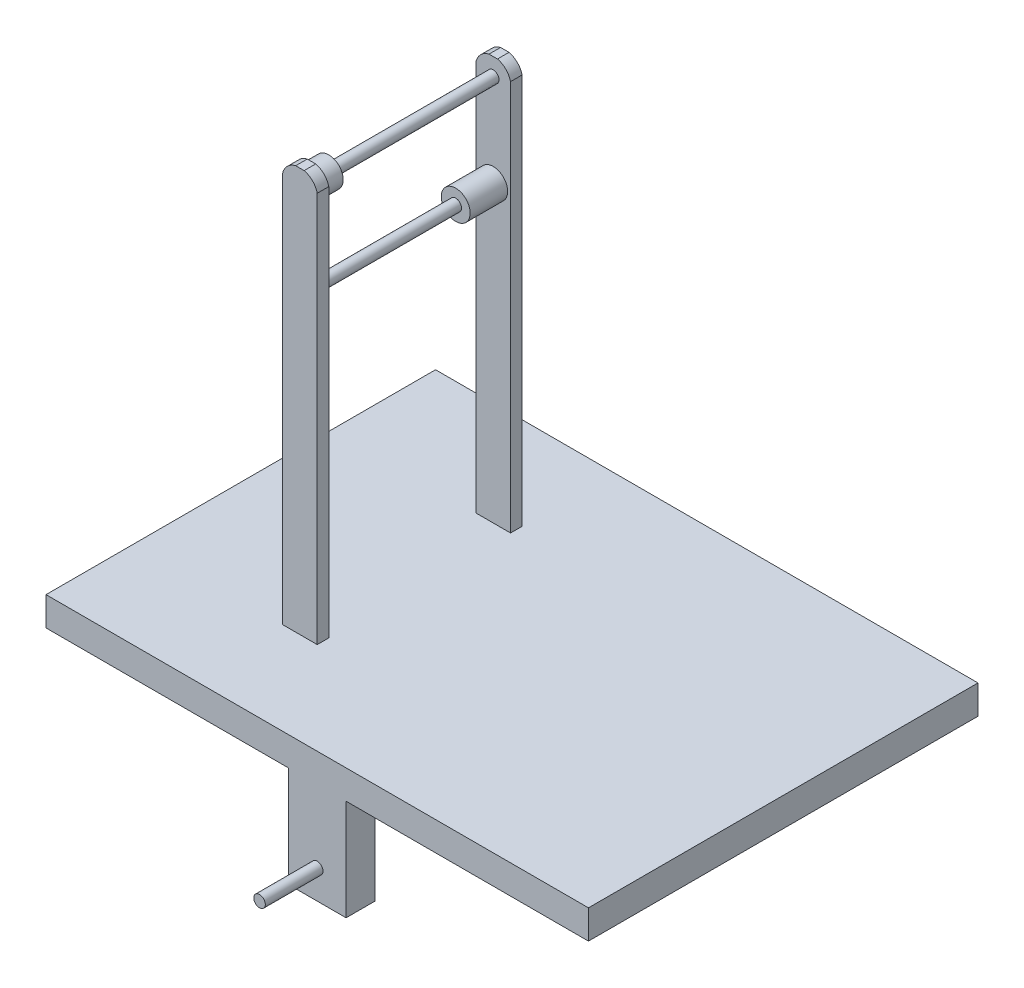
ISO-10303-21;
HEADER;
FILE_DESCRIPTION(('STEP AP214'),'2;1');
FILE_NAME('part.step','',(''),(''),'','','');
FILE_SCHEMA(('AUTOMOTIVE_DESIGN { 1 0 10303 214 1 1 1 1 }'));
ENDSEC;
DATA;
#1=APPLICATION_CONTEXT('core data for automotive mechanical design processes');
#2=APPLICATION_PROTOCOL_DEFINITION('international standard','automotive_design',2000,#1);
#3=PRODUCT_CONTEXT('',#1,'mechanical');
#4=PRODUCT('Part','Part','',(#3));
#5=PRODUCT_RELATED_PRODUCT_CATEGORY('part','',(#4));
#6=PRODUCT_DEFINITION_FORMATION('','',#4);
#7=PRODUCT_DEFINITION_CONTEXT('part definition',#1,'design');
#8=PRODUCT_DEFINITION('design','',#6,#7);
#9=PRODUCT_DEFINITION_SHAPE('','',#8);
#10=(LENGTH_UNIT() NAMED_UNIT(*) SI_UNIT(.MILLI.,.METRE.));
#11=(NAMED_UNIT(*) PLANE_ANGLE_UNIT() SI_UNIT($,.RADIAN.));
#12=(NAMED_UNIT(*) SI_UNIT($,.STERADIAN.) SOLID_ANGLE_UNIT());
#13=UNCERTAINTY_MEASURE_WITH_UNIT(LENGTH_MEASURE(1.E-05),#10,'distance_accuracy_value','');
#14=(GEOMETRIC_REPRESENTATION_CONTEXT(3) GLOBAL_UNCERTAINTY_ASSIGNED_CONTEXT((#13)) GLOBAL_UNIT_ASSIGNED_CONTEXT((#10,
#11,#12)) REPRESENTATION_CONTEXT('',''));
#15=CARTESIAN_POINT('',(0.,0.,0.));
#16=DIRECTION('',(0.,0.,1.));
#17=DIRECTION('',(1.,0.,0.));
#18=AXIS2_PLACEMENT_3D('',#15,#16,#17);
#19=CARTESIAN_POINT('',(0.,0.,0.));
#20=DIRECTION('',(0.,-1.,0.));
#21=DIRECTION('',(0.,0.,-1.));
#22=AXIS2_PLACEMENT_3D('',#19,#20,#21);
#23=PLANE('',#22);
#24=DIRECTION('',(-1.,0.,0.));
#25=VECTOR('',#24,1.);
#26=CARTESIAN_POINT('',(104.,0.,-125.));
#27=LINE('',#26,#25);
#28=CARTESIAN_POINT('',(104.,0.,-125.));
#29=VERTEX_POINT('',#28);
#30=CARTESIAN_POINT('',(84.,0.,-125.));
#31=VERTEX_POINT('',#30);
#32=EDGE_CURVE('E400',#29,#31,#27,.T.);
#33=ORIENTED_EDGE('',*,*,#32,.F.);
#34=DIRECTION('',(0.,0.,1.));
#35=VECTOR('',#34,1.);
#36=CARTESIAN_POINT('',(104.,0.,-135.));
#37=LINE('',#36,#35);
#38=CARTESIAN_POINT('',(104.,0.,-135.));
#39=VERTEX_POINT('',#38);
#40=EDGE_CURVE('E218',#39,#29,#37,.T.);
#41=ORIENTED_EDGE('',*,*,#40,.F.);
#42=DIRECTION('',(-1.,0.,0.));
#43=VECTOR('',#42,1.);
#44=CARTESIAN_POINT('',(0.,0.,-135.));
#45=LINE('',#44,#43);
#46=CARTESIAN_POINT('',(188.,0.,-135.));
#47=VERTEX_POINT('',#46);
#48=EDGE_CURVE('E326',#47,#39,#45,.T.);
#49=ORIENTED_EDGE('',*,*,#48,.F.);
#50=DIRECTION('',(0.,0.,-1.));
#51=VECTOR('',#50,1.);
#52=CARTESIAN_POINT('',(188.,0.,0.));
#53=LINE('',#52,#51);
#54=CARTESIAN_POINT('',(188.,0.,0.));
#55=VERTEX_POINT('',#54);
#56=EDGE_CURVE('E339',#55,#47,#53,.T.);
#57=ORIENTED_EDGE('',*,*,#56,.F.);
#58=DIRECTION('',(1.,0.,0.));
#59=VECTOR('',#58,1.);
#60=CARTESIAN_POINT('',(0.,0.,0.));
#61=LINE('',#60,#59);
#62=CARTESIAN_POINT('',(104.,0.,0.));
#63=VERTEX_POINT('',#62);
#64=EDGE_CURVE('E335',#63,#55,#61,.T.);
#65=ORIENTED_EDGE('',*,*,#64,.F.);
#66=DIRECTION('',(0.,0.,1.));
#67=VECTOR('',#66,1.);
#68=CARTESIAN_POINT('',(104.,0.,0.));
#69=LINE('',#68,#67);
#70=CARTESIAN_POINT('',(104.,0.,-10.));
#71=VERTEX_POINT('',#70);
#72=EDGE_CURVE('E232',#71,#63,#69,.T.);
#73=ORIENTED_EDGE('',*,*,#72,.F.);
#74=DIRECTION('',(1.,0.,0.));
#75=VECTOR('',#74,1.);
#76=CARTESIAN_POINT('',(84.,0.,-10.));
#77=LINE('',#76,#75);
#78=CARTESIAN_POINT('',(84.,0.,-10.));
#79=VERTEX_POINT('',#78);
#80=EDGE_CURVE('E58',#79,#71,#77,.T.);
#81=ORIENTED_EDGE('',*,*,#80,.F.);
#82=DIRECTION('',(0.,0.,-1.));
#83=VECTOR('',#82,1.);
#84=CARTESIAN_POINT('',(84.,0.,0.));
#85=LINE('',#84,#83);
#86=CARTESIAN_POINT('',(84.,0.,0.));
#87=VERTEX_POINT('',#86);
#88=EDGE_CURVE('E223',#87,#79,#85,.T.);
#89=ORIENTED_EDGE('',*,*,#88,.F.);
#90=CARTESIAN_POINT('',(0.,0.,0.));
#91=VERTEX_POINT('',#90);
#92=EDGE_CURVE('E336',#91,#87,#61,.T.);
#93=ORIENTED_EDGE('',*,*,#92,.F.);
#94=DIRECTION('',(0.,0.,1.));
#95=VECTOR('',#94,1.);
#96=CARTESIAN_POINT('',(0.,0.,0.));
#97=LINE('',#96,#95);
#98=CARTESIAN_POINT('',(0.,0.,-135.));
#99=VERTEX_POINT('',#98);
#100=EDGE_CURVE('E322',#99,#91,#97,.T.);
#101=ORIENTED_EDGE('',*,*,#100,.F.);
#102=CARTESIAN_POINT('',(84.,0.,-135.));
#103=VERTEX_POINT('',#102);
#104=EDGE_CURVE('E341',#103,#99,#45,.T.);
#105=ORIENTED_EDGE('',*,*,#104,.F.);
#106=DIRECTION('',(0.,0.,-1.));
#107=VECTOR('',#106,1.);
#108=CARTESIAN_POINT('',(84.,0.,-135.));
#109=LINE('',#108,#107);
#110=EDGE_CURVE('E214',#31,#103,#109,.T.);
#111=ORIENTED_EDGE('',*,*,#110,.F.);
#112=EDGE_LOOP('',(#33,#41,#49,#57,#65,#73,#81,#89,#93,#101,#105,#111));
#113=FACE_BOUND('',#112,.T.);
#114=ADVANCED_FACE('F35',(#113),#23,.T.);
#115=CARTESIAN_POINT('',(50.,150.,-32.));
#116=DIRECTION('',(1.,0.,0.));
#117=DIRECTION('',(0.,0.,-1.));
#118=AXIS2_PLACEMENT_3D('',#115,#116,#117);
#119=PLANE('',#118);
#120=DIRECTION('',(0.,0.,1.));
#121=VECTOR('',#120,1.);
#122=CARTESIAN_POINT('',(50.,145.469087672694,-135.));
#123=LINE('',#122,#121);
#124=CARTESIAN_POINT('',(50.,145.469087672694,-36.));
#125=VERTEX_POINT('',#124);
#126=CARTESIAN_POINT('',(50.,145.469087672694,-32.));
#127=VERTEX_POINT('',#126);
#128=EDGE_CURVE('E258',#125,#127,#123,.T.);
#129=ORIENTED_EDGE('',*,*,#128,.F.);
#130=DIRECTION('',(0.,-1.,0.));
#131=VECTOR('',#130,1.);
#132=CARTESIAN_POINT('',(50.,150.,-36.));
#133=LINE('',#132,#131);
#134=CARTESIAN_POINT('',(50.,10.,-36.));
#135=VERTEX_POINT('',#134);
#136=EDGE_CURVE('E292',#125,#135,#133,.T.);
#137=ORIENTED_EDGE('',*,*,#136,.T.);
#138=DIRECTION('',(0.,0.,1.));
#139=VECTOR('',#138,1.);
#140=CARTESIAN_POINT('',(50.,10.,-32.));
#141=LINE('',#140,#139);
#142=CARTESIAN_POINT('',(50.,10.,-32.));
#143=VERTEX_POINT('',#142);
#144=EDGE_CURVE('E294',#135,#143,#141,.T.);
#145=ORIENTED_EDGE('',*,*,#144,.T.);
#146=DIRECTION('',(0.,-1.,0.));
#147=VECTOR('',#146,1.);
#148=CARTESIAN_POINT('',(50.,150.,-32.));
#149=LINE('',#148,#147);
#150=EDGE_CURVE('E320',#127,#143,#149,.T.);
#151=ORIENTED_EDGE('',*,*,#150,.F.);
#152=EDGE_LOOP('',(#129,#137,#145,#151));
#153=FACE_BOUND('',#152,.T.);
#154=ADVANCED_FACE('F455',(#153),#119,.F.);
#155=CARTESIAN_POINT('',(62.,150.,-32.));
#156=DIRECTION('',(-1.,0.,0.));
#157=DIRECTION('',(0.,0.,1.));
#158=AXIS2_PLACEMENT_3D('',#155,#156,#157);
#159=PLANE('',#158);
#160=DIRECTION('',(0.,0.,1.));
#161=VECTOR('',#160,1.);
#162=CARTESIAN_POINT('',(62.,145.469087672694,-135.));
#163=LINE('',#162,#161);
#164=CARTESIAN_POINT('',(62.,145.469087672694,-36.));
#165=VERTEX_POINT('',#164);
#166=CARTESIAN_POINT('',(62.,145.469087672694,-32.));
#167=VERTEX_POINT('',#166);
#168=EDGE_CURVE('E261',#165,#167,#163,.T.);
#169=ORIENTED_EDGE('',*,*,#168,.T.);
#170=DIRECTION('',(0.,-1.,0.));
#171=VECTOR('',#170,1.);
#172=CARTESIAN_POINT('',(62.,150.,-32.));
#173=LINE('',#172,#171);
#174=CARTESIAN_POINT('',(62.,10.,-32.));
#175=VERTEX_POINT('',#174);
#176=EDGE_CURVE('E318',#167,#175,#173,.T.);
#177=ORIENTED_EDGE('',*,*,#176,.T.);
#178=DIRECTION('',(0.,0.,-1.));
#179=VECTOR('',#178,1.);
#180=CARTESIAN_POINT('',(62.,10.,-32.));
#181=LINE('',#180,#179);
#182=CARTESIAN_POINT('',(62.,10.,-36.));
#183=VERTEX_POINT('',#182);
#184=EDGE_CURVE('E310',#175,#183,#181,.T.);
#185=ORIENTED_EDGE('',*,*,#184,.T.);
#186=DIRECTION('',(0.,-1.,0.));
#187=VECTOR('',#186,1.);
#188=CARTESIAN_POINT('',(62.,150.,-36.));
#189=LINE('',#188,#187);
#190=EDGE_CURVE('E279',#165,#183,#189,.T.);
#191=ORIENTED_EDGE('',*,*,#190,.F.);
#192=EDGE_LOOP('',(#169,#177,#185,#191));
#193=FACE_BOUND('',#192,.T.);
#194=ADVANCED_FACE('F464',(#193),#159,.F.);
#195=CARTESIAN_POINT('',(0.,150.,0.));
#196=DIRECTION('',(0.,-1.,0.));
#197=DIRECTION('',(0.,0.,-1.));
#198=AXIS2_PLACEMENT_3D('',#195,#196,#197);
#199=PLANE('',#198);
#200=DIRECTION('',(0.,0.,1.));
#201=VECTOR('',#200,1.);
#202=CARTESIAN_POINT('',(57.4690876726942,150.,-135.));
#203=LINE('',#202,#201);
#204=CARTESIAN_POINT('',(57.4690876726942,150.,-36.));
#205=VERTEX_POINT('',#204);
#206=CARTESIAN_POINT('',(57.4690876726942,150.,-32.));
#207=VERTEX_POINT('',#206);
#208=EDGE_CURVE('E277',#205,#207,#203,.T.);
#209=ORIENTED_EDGE('',*,*,#208,.F.);
#210=DIRECTION('',(-1.,0.,0.));
#211=VECTOR('',#210,1.);
#212=CARTESIAN_POINT('',(0.,150.,-36.));
#213=LINE('',#212,#211);
#214=CARTESIAN_POINT('',(54.5309123273058,150.,-36.));
#215=VERTEX_POINT('',#214);
#216=EDGE_CURVE('E358',#205,#215,#213,.T.);
#217=ORIENTED_EDGE('',*,*,#216,.T.);
#218=DIRECTION('',(0.,0.,1.));
#219=VECTOR('',#218,1.);
#220=CARTESIAN_POINT('',(54.5309123273058,150.,-135.));
#221=LINE('',#220,#219);
#222=CARTESIAN_POINT('',(54.5309123273058,150.,-32.));
#223=VERTEX_POINT('',#222);
#224=EDGE_CURVE('E274',#223,#215,#221,.F.);
#225=ORIENTED_EDGE('',*,*,#224,.F.);
#226=DIRECTION('',(1.,0.,0.));
#227=VECTOR('',#226,1.);
#228=CARTESIAN_POINT('',(50.,150.,-32.));
#229=LINE('',#228,#227);
#230=EDGE_CURVE('E295',#223,#207,#229,.T.);
#231=ORIENTED_EDGE('',*,*,#230,.T.);
#232=EDGE_LOOP('',(#209,#217,#225,#231));
#233=FACE_BOUND('',#232,.T.);
#234=ADVANCED_FACE('F475',(#233),#199,.F.);
#235=CARTESIAN_POINT('',(50.,145.469087672694,-103.));
#236=VERTEX_POINT('',#235);
#237=CARTESIAN_POINT('',(50.,145.469087672694,-99.));
#238=VERTEX_POINT('',#237);
#239=EDGE_CURVE('E260',#236,#238,#123,.T.);
#240=ORIENTED_EDGE('',*,*,#239,.F.);
#241=DIRECTION('',(0.,-1.,0.));
#242=VECTOR('',#241,1.);
#243=CARTESIAN_POINT('',(50.,150.,-103.));
#244=LINE('',#243,#242);
#245=CARTESIAN_POINT('',(50.,10.,-103.));
#246=VERTEX_POINT('',#245);
#247=EDGE_CURVE('E302',#236,#246,#244,.T.);
#248=ORIENTED_EDGE('',*,*,#247,.T.);
#249=CARTESIAN_POINT('',(50.,10.,-99.));
#250=VERTEX_POINT('',#249);
#251=EDGE_CURVE('E303',#246,#250,#141,.T.);
#252=ORIENTED_EDGE('',*,*,#251,.T.);
#253=DIRECTION('',(0.,1.,0.));
#254=VECTOR('',#253,1.);
#255=CARTESIAN_POINT('',(50.,150.,-99.));
#256=LINE('',#255,#254);
#257=EDGE_CURVE('E287',#250,#238,#256,.T.);
#258=ORIENTED_EDGE('',*,*,#257,.T.);
#259=EDGE_LOOP('',(#240,#248,#252,#258));
#260=FACE_BOUND('',#259,.T.);
#261=ADVANCED_FACE('F497',(#260),#119,.F.);
#262=CARTESIAN_POINT('',(50.,150.,-32.));
#263=DIRECTION('',(0.,0.,-1.));
#264=DIRECTION('',(-1.,0.,0.));
#265=AXIS2_PLACEMENT_3D('',#262,#263,#264);
#266=PLANE('',#265);
#267=CARTESIAN_POINT('',(56.,144.,-32.));
#268=DIRECTION('',(0.,0.,1.));
#269=DIRECTION('',(1.,0.,0.));
#270=AXIS2_PLACEMENT_3D('',#267,#268,#269);
#271=CIRCLE('',#270,6.17723389471876);
#272=EDGE_CURVE('E254',#223,#127,#271,.T.);
#273=ORIENTED_EDGE('',*,*,#272,.T.);
#274=ORIENTED_EDGE('',*,*,#150,.T.);
#275=DIRECTION('',(1.,0.,0.));
#276=VECTOR('',#275,1.);
#277=CARTESIAN_POINT('',(50.,10.,-32.));
#278=LINE('',#277,#276);
#279=EDGE_CURVE('E306',#143,#175,#278,.T.);
#280=ORIENTED_EDGE('',*,*,#279,.T.);
#281=ORIENTED_EDGE('',*,*,#176,.F.);
#282=EDGE_CURVE('E255',#167,#207,#271,.T.);
#283=ORIENTED_EDGE('',*,*,#282,.T.);
#284=ORIENTED_EDGE('',*,*,#230,.F.);
#285=EDGE_LOOP('',(#273,#274,#280,#281,#283,#284));
#286=FACE_BOUND('',#285,.T.);
#287=ADVANCED_FACE('F468',(#286),#266,.F.);
#288=CARTESIAN_POINT('',(62.,145.469087672694,-103.));
#289=VERTEX_POINT('',#288);
#290=CARTESIAN_POINT('',(62.,145.469087672694,-99.));
#291=VERTEX_POINT('',#290);
#292=EDGE_CURVE('E264',#289,#291,#163,.T.);
#293=ORIENTED_EDGE('',*,*,#292,.T.);
#294=DIRECTION('',(0.,1.,0.));
#295=VECTOR('',#294,1.);
#296=CARTESIAN_POINT('',(62.,150.,-99.));
#297=LINE('',#296,#295);
#298=CARTESIAN_POINT('',(62.,10.,-99.));
#299=VERTEX_POINT('',#298);
#300=EDGE_CURVE('E281',#299,#291,#297,.T.);
#301=ORIENTED_EDGE('',*,*,#300,.F.);
#302=CARTESIAN_POINT('',(62.,10.,-103.));
#303=VERTEX_POINT('',#302);
#304=EDGE_CURVE('E309',#299,#303,#181,.T.);
#305=ORIENTED_EDGE('',*,*,#304,.T.);
#306=DIRECTION('',(0.,-1.,0.));
#307=VECTOR('',#306,1.);
#308=CARTESIAN_POINT('',(62.,150.,-103.));
#309=LINE('',#308,#307);
#310=EDGE_CURVE('E316',#289,#303,#309,.T.);
#311=ORIENTED_EDGE('',*,*,#310,.F.);
#312=EDGE_LOOP('',(#293,#301,#305,#311));
#313=FACE_BOUND('',#312,.T.);
#314=ADVANCED_FACE('F634',(#313),#159,.F.);
#315=CARTESIAN_POINT('',(50.,150.,-103.));
#316=DIRECTION('',(0.,0.,1.));
#317=DIRECTION('',(1.,0.,0.));
#318=AXIS2_PLACEMENT_3D('',#315,#316,#317);
#319=PLANE('',#318);
#320=CARTESIAN_POINT('',(56.,144.,-103.));
#321=DIRECTION('',(0.,0.,1.));
#322=DIRECTION('',(1.,0.,0.));
#323=AXIS2_PLACEMENT_3D('',#320,#321,#322);
#324=CIRCLE('',#323,6.17723389471876);
#325=CARTESIAN_POINT('',(57.4690876726942,150.,-103.));
#326=VERTEX_POINT('',#325);
#327=EDGE_CURVE('E270',#289,#326,#324,.T.);
#328=ORIENTED_EDGE('',*,*,#327,.F.);
#329=ORIENTED_EDGE('',*,*,#310,.T.);
#330=DIRECTION('',(-1.,0.,0.));
#331=VECTOR('',#330,1.);
#332=CARTESIAN_POINT('',(50.,10.,-103.));
#333=LINE('',#332,#331);
#334=EDGE_CURVE('E299',#303,#246,#333,.T.);
#335=ORIENTED_EDGE('',*,*,#334,.T.);
#336=ORIENTED_EDGE('',*,*,#247,.F.);
#337=CARTESIAN_POINT('',(54.5309123273058,150.,-103.));
#338=VERTEX_POINT('',#337);
#339=EDGE_CURVE('E267',#338,#236,#324,.T.);
#340=ORIENTED_EDGE('',*,*,#339,.F.);
#341=DIRECTION('',(-1.,0.,0.));
#342=VECTOR('',#341,1.);
#343=CARTESIAN_POINT('',(50.,150.,-103.));
#344=LINE('',#343,#342);
#345=EDGE_CURVE('E298',#326,#338,#344,.T.);
#346=ORIENTED_EDGE('',*,*,#345,.F.);
#347=EDGE_LOOP('',(#328,#329,#335,#336,#340,#346));
#348=FACE_BOUND('',#347,.T.);
#349=ADVANCED_FACE('F782',(#348),#319,.F.);
#350=DIRECTION('',(0.,0.,1.));
#351=VECTOR('',#350,1.);
#352=CARTESIAN_POINT('',(57.4690876726942,150.,-135.));
#353=LINE('',#352,#351);
#354=CARTESIAN_POINT('',(57.4690876726942,150.,-99.));
#355=VERTEX_POINT('',#354);
#356=EDGE_CURVE('E269',#326,#355,#353,.T.);
#357=ORIENTED_EDGE('',*,*,#356,.F.);
#358=ORIENTED_EDGE('',*,*,#345,.T.);
#359=DIRECTION('',(0.,0.,1.));
#360=VECTOR('',#359,1.);
#361=CARTESIAN_POINT('',(54.5309123273058,150.,-135.));
#362=LINE('',#361,#360);
#363=CARTESIAN_POINT('',(54.5309123273058,150.,-99.));
#364=VERTEX_POINT('',#363);
#365=EDGE_CURVE('E265',#364,#338,#362,.F.);
#366=ORIENTED_EDGE('',*,*,#365,.F.);
#367=DIRECTION('',(1.,0.,0.));
#368=VECTOR('',#367,1.);
#369=CARTESIAN_POINT('',(0.,150.,-99.));
#370=LINE('',#369,#368);
#371=EDGE_CURVE('E355',#364,#355,#370,.T.);
#372=ORIENTED_EDGE('',*,*,#371,.T.);
#373=EDGE_LOOP('',(#357,#358,#366,#372));
#374=FACE_BOUND('',#373,.T.);
#375=ADVANCED_FACE('F687',(#374),#199,.F.);
#376=CARTESIAN_POINT('',(-78.,150.,-36.));
#377=DIRECTION('',(0.,0.,1.));
#378=DIRECTION('',(0.,-1.,0.));
#379=AXIS2_PLACEMENT_3D('',#376,#377,#378);
#380=PLANE('',#379);
#381=CARTESIAN_POINT('',(56.,144.,-36.));
#382=DIRECTION('',(0.,0.,1.));
#383=DIRECTION('',(0.,-1.,0.));
#384=AXIS2_PLACEMENT_3D('',#381,#382,#383);
#385=CIRCLE('',#384,5.);
#386=CARTESIAN_POINT('',(56.,139.,-36.));
#387=VERTEX_POINT('',#386);
#388=EDGE_CURVE('E11',#387,#387,#385,.F.);
#389=ORIENTED_EDGE('',*,*,#388,.F.);
#390=EDGE_LOOP('',(#389));
#391=FACE_BOUND('',#390,.T.);
#392=CARTESIAN_POINT('',(56.,112.,-36.));
#393=DIRECTION('',(0.,0.,1.));
#394=DIRECTION('',(0.,-1.,0.));
#395=AXIS2_PLACEMENT_3D('',#392,#393,#394);
#396=CIRCLE('',#395,2.);
#397=CARTESIAN_POINT('',(56.,110.,-36.));
#398=VERTEX_POINT('',#397);
#399=EDGE_CURVE('E373',#398,#398,#396,.F.);
#400=ORIENTED_EDGE('',*,*,#399,.F.);
#401=EDGE_LOOP('',(#400));
#402=FACE_BOUND('',#401,.T.);
#403=CARTESIAN_POINT('',(56.,144.,-36.));
#404=DIRECTION('',(0.,0.,1.));
#405=DIRECTION('',(0.,-1.,0.));
#406=AXIS2_PLACEMENT_3D('',#403,#404,#405);
#407=CIRCLE('',#406,6.17723389471876);
#408=EDGE_CURVE('E275',#165,#205,#407,.T.);
#409=ORIENTED_EDGE('',*,*,#408,.F.);
#410=ORIENTED_EDGE('',*,*,#190,.T.);
#411=DIRECTION('',(1.,0.,0.));
#412=VECTOR('',#411,1.);
#413=CARTESIAN_POINT('',(-78.,10.,-36.));
#414=LINE('',#413,#412);
#415=EDGE_CURVE('E284',#135,#183,#414,.T.);
#416=ORIENTED_EDGE('',*,*,#415,.F.);
#417=ORIENTED_EDGE('',*,*,#136,.F.);
#418=EDGE_CURVE('E272',#215,#125,#407,.T.);
#419=ORIENTED_EDGE('',*,*,#418,.F.);
#420=ORIENTED_EDGE('',*,*,#216,.F.);
#421=EDGE_LOOP('',(#409,#410,#416,#417,#419,#420));
#422=FACE_BOUND('',#421,.T.);
#423=ADVANCED_FACE('F460',(#391,#402,#422),#380,.F.);
#424=CARTESIAN_POINT('',(-78.,150.,-99.));
#425=DIRECTION('',(0.,0.,-1.));
#426=DIRECTION('',(0.,1.,0.));
#427=AXIS2_PLACEMENT_3D('',#424,#425,#426);
#428=PLANE('',#427);
#429=CARTESIAN_POINT('',(56.,112.,-99.));
#430=DIRECTION('',(0.,0.,-1.));
#431=DIRECTION('',(0.,1.,0.));
#432=AXIS2_PLACEMENT_3D('',#429,#430,#431);
#433=CIRCLE('',#432,5.);
#434=CARTESIAN_POINT('',(51.,112.,-99.));
#435=VERTEX_POINT('',#434);
#436=EDGE_CURVE('E43',#435,#435,#433,.F.);
#437=ORIENTED_EDGE('',*,*,#436,.F.);
#438=EDGE_LOOP('',(#437));
#439=FACE_BOUND('',#438,.T.);
#440=CARTESIAN_POINT('',(56.,144.,-99.));
#441=DIRECTION('',(0.,0.,-1.));
#442=DIRECTION('',(0.,1.,0.));
#443=AXIS2_PLACEMENT_3D('',#440,#441,#442);
#444=CIRCLE('',#443,2.);
#445=CARTESIAN_POINT('',(56.,146.,-99.));
#446=VERTEX_POINT('',#445);
#447=EDGE_CURVE('E361',#446,#446,#444,.F.);
#448=ORIENTED_EDGE('',*,*,#447,.F.);
#449=EDGE_LOOP('',(#448));
#450=FACE_BOUND('',#449,.T.);
#451=CARTESIAN_POINT('',(56.,144.,-99.));
#452=DIRECTION('',(0.,0.,-1.));
#453=DIRECTION('',(0.,1.,0.));
#454=AXIS2_PLACEMENT_3D('',#451,#452,#453);
#455=CIRCLE('',#454,6.17723389471876);
#456=EDGE_CURVE('E366',#355,#291,#455,.T.);
#457=ORIENTED_EDGE('',*,*,#456,.F.);
#458=ORIENTED_EDGE('',*,*,#371,.F.);
#459=EDGE_CURVE('E364',#238,#364,#455,.T.);
#460=ORIENTED_EDGE('',*,*,#459,.F.);
#461=ORIENTED_EDGE('',*,*,#257,.F.);
#462=DIRECTION('',(1.,0.,0.));
#463=VECTOR('',#462,1.);
#464=CARTESIAN_POINT('',(-78.,10.,-99.));
#465=LINE('',#464,#463);
#466=EDGE_CURVE('E285',#250,#299,#465,.T.);
#467=ORIENTED_EDGE('',*,*,#466,.T.);
#468=ORIENTED_EDGE('',*,*,#300,.T.);
#469=EDGE_LOOP('',(#457,#458,#460,#461,#467,#468));
#470=FACE_BOUND('',#469,.T.);
#471=ADVANCED_FACE('F441',(#439,#450,#470),#428,.F.);
#472=CARTESIAN_POINT('',(0.,10.,0.));
#473=DIRECTION('',(0.,-1.,0.));
#474=DIRECTION('',(0.,0.,-1.));
#475=AXIS2_PLACEMENT_3D('',#472,#473,#474);
#476=PLANE('',#475);
#477=DIRECTION('',(0.,0.,1.));
#478=VECTOR('',#477,1.);
#479=CARTESIAN_POINT('',(0.,10.,0.));
#480=LINE('',#479,#478);
#481=CARTESIAN_POINT('',(0.,10.,-135.));
#482=VERTEX_POINT('',#481);
#483=CARTESIAN_POINT('',(0.,10.,0.));
#484=VERTEX_POINT('',#483);
#485=EDGE_CURVE('E323',#482,#484,#480,.T.);
#486=ORIENTED_EDGE('',*,*,#485,.T.);
#487=DIRECTION('',(1.,0.,0.));
#488=VECTOR('',#487,1.);
#489=CARTESIAN_POINT('',(0.,10.,0.));
#490=LINE('',#489,#488);
#491=CARTESIAN_POINT('',(188.,10.,0.));
#492=VERTEX_POINT('',#491);
#493=EDGE_CURVE('E325',#484,#492,#490,.T.);
#494=ORIENTED_EDGE('',*,*,#493,.T.);
#495=DIRECTION('',(0.,0.,-1.));
#496=VECTOR('',#495,1.);
#497=CARTESIAN_POINT('',(188.,10.,0.));
#498=LINE('',#497,#496);
#499=CARTESIAN_POINT('',(188.,10.,-135.));
#500=VERTEX_POINT('',#499);
#501=EDGE_CURVE('E328',#492,#500,#498,.T.);
#502=ORIENTED_EDGE('',*,*,#501,.T.);
#503=DIRECTION('',(-1.,0.,0.));
#504=VECTOR('',#503,1.);
#505=CARTESIAN_POINT('',(0.,10.,-135.));
#506=LINE('',#505,#504);
#507=EDGE_CURVE('E330',#500,#482,#506,.T.);
#508=ORIENTED_EDGE('',*,*,#507,.T.);
#509=EDGE_LOOP('',(#486,#494,#502,#508));
#510=FACE_BOUND('',#509,.T.);
#511=ORIENTED_EDGE('',*,*,#466,.F.);
#512=ORIENTED_EDGE('',*,*,#251,.F.);
#513=ORIENTED_EDGE('',*,*,#334,.F.);
#514=ORIENTED_EDGE('',*,*,#304,.F.);
#515=EDGE_LOOP('',(#511,#512,#513,#514));
#516=FACE_BOUND('',#515,.T.);
#517=ORIENTED_EDGE('',*,*,#144,.F.);
#518=ORIENTED_EDGE('',*,*,#415,.T.);
#519=ORIENTED_EDGE('',*,*,#184,.F.);
#520=ORIENTED_EDGE('',*,*,#279,.F.);
#521=EDGE_LOOP('',(#517,#518,#519,#520));
#522=FACE_BOUND('',#521,.T.);
#523=ADVANCED_FACE('F438',(#510,#516,#522),#476,.F.);
#524=CARTESIAN_POINT('',(0.,10.,0.));
#525=DIRECTION('',(1.,0.,0.));
#526=DIRECTION('',(0.,0.,-1.));
#527=AXIS2_PLACEMENT_3D('',#524,#525,#526);
#528=PLANE('',#527);
#529=ORIENTED_EDGE('',*,*,#100,.T.);
#530=DIRECTION('',(0.,-1.,0.));
#531=VECTOR('',#530,1.);
#532=CARTESIAN_POINT('',(0.,10.,0.));
#533=LINE('',#532,#531);
#534=EDGE_CURVE('E352',#484,#91,#533,.T.);
#535=ORIENTED_EDGE('',*,*,#534,.F.);
#536=ORIENTED_EDGE('',*,*,#485,.F.);
#537=DIRECTION('',(0.,-1.,0.));
#538=VECTOR('',#537,1.);
#539=CARTESIAN_POINT('',(0.,10.,-135.));
#540=LINE('',#539,#538);
#541=EDGE_CURVE('E332',#482,#99,#540,.T.);
#542=ORIENTED_EDGE('',*,*,#541,.T.);
#543=EDGE_LOOP('',(#529,#535,#536,#542));
#544=FACE_BOUND('',#543,.T.);
#545=ADVANCED_FACE('F37',(#544),#528,.F.);
#546=CARTESIAN_POINT('',(0.,10.,0.));
#547=DIRECTION('',(0.,0.,-1.));
#548=DIRECTION('',(-1.,0.,0.));
#549=AXIS2_PLACEMENT_3D('',#546,#547,#548);
#550=PLANE('',#549);
#551=CARTESIAN_POINT('',(94.,-25.,0.));
#552=DIRECTION('',(0.,0.,-1.));
#553=DIRECTION('',(-1.,0.,0.));
#554=AXIS2_PLACEMENT_3D('',#551,#552,#553);
#555=CIRCLE('',#554,2.);
#556=CARTESIAN_POINT('',(92.,-25.,0.));
#557=VERTEX_POINT('',#556);
#558=EDGE_CURVE('E367',#557,#557,#555,.F.);
#559=ORIENTED_EDGE('',*,*,#558,.F.);
#560=EDGE_LOOP('',(#559));
#561=FACE_BOUND('',#560,.T.);
#562=ORIENTED_EDGE('',*,*,#92,.T.);
#563=DIRECTION('',(0.,1.,0.));
#564=VECTOR('',#563,1.);
#565=CARTESIAN_POINT('',(84.,-35.,0.));
#566=LINE('',#565,#564);
#567=CARTESIAN_POINT('',(84.,-35.,0.));
#568=VERTEX_POINT('',#567);
#569=EDGE_CURVE('E238',#568,#87,#566,.T.);
#570=ORIENTED_EDGE('',*,*,#569,.F.);
#571=DIRECTION('',(-1.,0.,0.));
#572=VECTOR('',#571,1.);
#573=CARTESIAN_POINT('',(84.,-35.,0.));
#574=LINE('',#573,#572);
#575=CARTESIAN_POINT('',(104.,-35.,0.));
#576=VERTEX_POINT('',#575);
#577=EDGE_CURVE('E236',#576,#568,#574,.T.);
#578=ORIENTED_EDGE('',*,*,#577,.F.);
#579=DIRECTION('',(0.,1.,0.));
#580=VECTOR('',#579,1.);
#581=CARTESIAN_POINT('',(104.,-35.,0.));
#582=LINE('',#581,#580);
#583=EDGE_CURVE('E246',#576,#63,#582,.T.);
#584=ORIENTED_EDGE('',*,*,#583,.T.);
#585=ORIENTED_EDGE('',*,*,#64,.T.);
#586=DIRECTION('',(0.,-1.,0.));
#587=VECTOR('',#586,1.);
#588=CARTESIAN_POINT('',(188.,10.,0.));
#589=LINE('',#588,#587);
#590=EDGE_CURVE('E349',#492,#55,#589,.T.);
#591=ORIENTED_EDGE('',*,*,#590,.F.);
#592=ORIENTED_EDGE('',*,*,#493,.F.);
#593=ORIENTED_EDGE('',*,*,#534,.T.);
#594=EDGE_LOOP('',(#562,#570,#578,#584,#585,#591,#592,#593));
#595=FACE_BOUND('',#594,.T.);
#596=ADVANCED_FACE('F421',(#561,#595),#550,.F.);
#597=CARTESIAN_POINT('',(188.,10.,0.));
#598=DIRECTION('',(-1.,0.,0.));
#599=DIRECTION('',(0.,0.,1.));
#600=AXIS2_PLACEMENT_3D('',#597,#598,#599);
#601=PLANE('',#600);
#602=ORIENTED_EDGE('',*,*,#56,.T.);
#603=DIRECTION('',(0.,-1.,0.));
#604=VECTOR('',#603,1.);
#605=CARTESIAN_POINT('',(188.,10.,-135.));
#606=LINE('',#605,#604);
#607=EDGE_CURVE('E346',#500,#47,#606,.T.);
#608=ORIENTED_EDGE('',*,*,#607,.F.);
#609=ORIENTED_EDGE('',*,*,#501,.F.);
#610=ORIENTED_EDGE('',*,*,#590,.T.);
#611=EDGE_LOOP('',(#602,#608,#609,#610));
#612=FACE_BOUND('',#611,.T.);
#613=ADVANCED_FACE('F412',(#612),#601,.F.);
#614=CARTESIAN_POINT('',(0.,10.,-135.));
#615=DIRECTION('',(0.,0.,1.));
#616=DIRECTION('',(1.,0.,0.));
#617=AXIS2_PLACEMENT_3D('',#614,#615,#616);
#618=PLANE('',#617);
#619=CARTESIAN_POINT('',(94.,-25.,-135.));
#620=DIRECTION('',(0.,0.,1.));
#621=DIRECTION('',(1.,0.,0.));
#622=AXIS2_PLACEMENT_3D('',#619,#620,#621);
#623=CIRCLE('',#622,2.);
#624=CARTESIAN_POINT('',(96.,-25.,-135.));
#625=VERTEX_POINT('',#624);
#626=EDGE_CURVE('E370',#625,#625,#623,.F.);
#627=ORIENTED_EDGE('',*,*,#626,.F.);
#628=EDGE_LOOP('',(#627));
#629=FACE_BOUND('',#628,.T.);
#630=ORIENTED_EDGE('',*,*,#48,.T.);
#631=DIRECTION('',(0.,1.,0.));
#632=VECTOR('',#631,1.);
#633=CARTESIAN_POINT('',(104.,-35.,-135.));
#634=LINE('',#633,#632);
#635=CARTESIAN_POINT('',(104.,-35.,-135.));
#636=VERTEX_POINT('',#635);
#637=EDGE_CURVE('E398',#636,#39,#634,.T.);
#638=ORIENTED_EDGE('',*,*,#637,.F.);
#639=DIRECTION('',(1.,0.,0.));
#640=VECTOR('',#639,1.);
#641=CARTESIAN_POINT('',(104.,-35.,-135.));
#642=LINE('',#641,#640);
#643=CARTESIAN_POINT('',(84.,-35.,-135.));
#644=VERTEX_POINT('',#643);
#645=EDGE_CURVE('E211',#644,#636,#642,.T.);
#646=ORIENTED_EDGE('',*,*,#645,.F.);
#647=DIRECTION('',(0.,1.,0.));
#648=VECTOR('',#647,1.);
#649=CARTESIAN_POINT('',(84.,-35.,-135.));
#650=LINE('',#649,#648);
#651=EDGE_CURVE('E50',#644,#103,#650,.T.);
#652=ORIENTED_EDGE('',*,*,#651,.T.);
#653=ORIENTED_EDGE('',*,*,#104,.T.);
#654=ORIENTED_EDGE('',*,*,#541,.F.);
#655=ORIENTED_EDGE('',*,*,#507,.F.);
#656=ORIENTED_EDGE('',*,*,#607,.T.);
#657=EDGE_LOOP('',(#630,#638,#646,#652,#653,#654,#655,#656));
#658=FACE_BOUND('',#657,.T.);
#659=ADVANCED_FACE('F406',(#629,#658),#618,.F.);
#660=CARTESIAN_POINT('',(56.,144.,-32.0000000000001));
#661=DIRECTION('',(0.,0.,-1.));
#662=DIRECTION('',(-1.,0.,0.));
#663=AXIS2_PLACEMENT_3D('',#660,#661,#662);
#664=CYLINDRICAL_SURFACE('',#663,2.);
#665=CARTESIAN_POINT('',(56.,144.,-42.));
#666=DIRECTION('',(0.,0.,-1.));
#667=DIRECTION('',(0.,1.,0.));
#668=AXIS2_PLACEMENT_3D('',#665,#666,#667);
#669=CIRCLE('',#668,2.);
#670=CARTESIAN_POINT('',(56.,146.,-42.));
#671=VERTEX_POINT('',#670);
#672=EDGE_CURVE('E380',#671,#671,#669,.T.);
#673=ORIENTED_EDGE('',*,*,#672,.T.);
#674=EDGE_LOOP('',(#673));
#675=FACE_BOUND('',#674,.T.);
#676=ORIENTED_EDGE('',*,*,#447,.T.);
#677=EDGE_LOOP('',(#676));
#678=FACE_BOUND('',#677,.T.);
#679=ADVANCED_FACE('F489',(#675,#678),#664,.T.);
#680=CARTESIAN_POINT('',(56.,144.,-135.));
#681=DIRECTION('',(0.,0.,1.));
#682=DIRECTION('',(1.,0.,0.));
#683=AXIS2_PLACEMENT_3D('',#680,#681,#682);
#684=CYLINDRICAL_SURFACE('',#683,6.17723389471876);
#685=ORIENTED_EDGE('',*,*,#339,.T.);
#686=ORIENTED_EDGE('',*,*,#239,.T.);
#687=ORIENTED_EDGE('',*,*,#459,.T.);
#688=ORIENTED_EDGE('',*,*,#365,.T.);
#689=EDGE_LOOP('',(#685,#686,#687,#688));
#690=FACE_BOUND('',#689,.T.);
#691=ADVANCED_FACE('F480',(#690),#684,.T.);
#692=ORIENTED_EDGE('',*,*,#327,.T.);
#693=ORIENTED_EDGE('',*,*,#356,.T.);
#694=ORIENTED_EDGE('',*,*,#456,.T.);
#695=ORIENTED_EDGE('',*,*,#292,.F.);
#696=EDGE_LOOP('',(#692,#693,#694,#695));
#697=FACE_BOUND('',#696,.T.);
#698=ADVANCED_FACE('F486',(#697),#684,.T.);
#699=ORIENTED_EDGE('',*,*,#224,.T.);
#700=ORIENTED_EDGE('',*,*,#418,.T.);
#701=ORIENTED_EDGE('',*,*,#128,.T.);
#702=ORIENTED_EDGE('',*,*,#272,.F.);
#703=EDGE_LOOP('',(#699,#700,#701,#702));
#704=FACE_BOUND('',#703,.T.);
#705=ADVANCED_FACE('F472',(#704),#684,.T.);
#706=ORIENTED_EDGE('',*,*,#208,.T.);
#707=ORIENTED_EDGE('',*,*,#282,.F.);
#708=ORIENTED_EDGE('',*,*,#168,.F.);
#709=ORIENTED_EDGE('',*,*,#408,.T.);
#710=EDGE_LOOP('',(#706,#707,#708,#709));
#711=FACE_BOUND('',#710,.T.);
#712=ADVANCED_FACE('F477',(#711),#684,.T.);
#713=CARTESIAN_POINT('',(84.,-35.,0.));
#714=DIRECTION('',(1.,0.,0.));
#715=DIRECTION('',(0.,0.,-1.));
#716=AXIS2_PLACEMENT_3D('',#713,#714,#715);
#717=PLANE('',#716);
#718=ORIENTED_EDGE('',*,*,#88,.T.);
#719=DIRECTION('',(0.,1.,0.));
#720=VECTOR('',#719,1.);
#721=CARTESIAN_POINT('',(84.,-35.,-10.));
#722=LINE('',#721,#720);
#723=CARTESIAN_POINT('',(84.,-35.,-10.));
#724=VERTEX_POINT('',#723);
#725=EDGE_CURVE('E252',#724,#79,#722,.T.);
#726=ORIENTED_EDGE('',*,*,#725,.F.);
#727=DIRECTION('',(0.,0.,-1.));
#728=VECTOR('',#727,1.);
#729=CARTESIAN_POINT('',(84.,-35.,0.));
#730=LINE('',#729,#728);
#731=EDGE_CURVE('E228',#568,#724,#730,.T.);
#732=ORIENTED_EDGE('',*,*,#731,.F.);
#733=ORIENTED_EDGE('',*,*,#569,.T.);
#734=EDGE_LOOP('',(#718,#726,#732,#733));
#735=FACE_BOUND('',#734,.T.);
#736=ADVANCED_FACE('F430',(#735),#717,.F.);
#737=CARTESIAN_POINT('',(84.,-35.,-10.));
#738=DIRECTION('',(0.,0.,1.));
#739=DIRECTION('',(1.,0.,0.));
#740=AXIS2_PLACEMENT_3D('',#737,#738,#739);
#741=PLANE('',#740);
#742=ORIENTED_EDGE('',*,*,#80,.T.);
#743=DIRECTION('',(0.,1.,0.));
#744=VECTOR('',#743,1.);
#745=CARTESIAN_POINT('',(104.,-35.,-10.));
#746=LINE('',#745,#744);
#747=CARTESIAN_POINT('',(104.,-35.,-10.));
#748=VERTEX_POINT('',#747);
#749=EDGE_CURVE('E249',#748,#71,#746,.T.);
#750=ORIENTED_EDGE('',*,*,#749,.F.);
#751=DIRECTION('',(1.,0.,0.));
#752=VECTOR('',#751,1.);
#753=CARTESIAN_POINT('',(84.,-35.,-10.));
#754=LINE('',#753,#752);
#755=EDGE_CURVE('E231',#724,#748,#754,.T.);
#756=ORIENTED_EDGE('',*,*,#755,.F.);
#757=ORIENTED_EDGE('',*,*,#725,.T.);
#758=EDGE_LOOP('',(#742,#750,#756,#757));
#759=FACE_BOUND('',#758,.T.);
#760=ADVANCED_FACE('F428',(#759),#741,.F.);
#761=CARTESIAN_POINT('',(104.,-35.,0.));
#762=DIRECTION('',(-1.,0.,0.));
#763=DIRECTION('',(0.,0.,1.));
#764=AXIS2_PLACEMENT_3D('',#761,#762,#763);
#765=PLANE('',#764);
#766=ORIENTED_EDGE('',*,*,#72,.T.);
#767=ORIENTED_EDGE('',*,*,#583,.F.);
#768=DIRECTION('',(0.,0.,1.));
#769=VECTOR('',#768,1.);
#770=CARTESIAN_POINT('',(104.,-35.,0.));
#771=LINE('',#770,#769);
#772=EDGE_CURVE('E234',#748,#576,#771,.T.);
#773=ORIENTED_EDGE('',*,*,#772,.F.);
#774=ORIENTED_EDGE('',*,*,#749,.T.);
#775=EDGE_LOOP('',(#766,#767,#773,#774));
#776=FACE_BOUND('',#775,.T.);
#777=ADVANCED_FACE('F417',(#776),#765,.F.);
#778=CARTESIAN_POINT('',(0.,-35.,0.));
#779=DIRECTION('',(0.,-1.,0.));
#780=DIRECTION('',(0.,0.,-1.));
#781=AXIS2_PLACEMENT_3D('',#778,#779,#780);
#782=PLANE('',#781);
#783=ORIENTED_EDGE('',*,*,#731,.T.);
#784=ORIENTED_EDGE('',*,*,#755,.T.);
#785=ORIENTED_EDGE('',*,*,#772,.T.);
#786=ORIENTED_EDGE('',*,*,#577,.T.);
#787=EDGE_LOOP('',(#783,#784,#785,#786));
#788=FACE_BOUND('',#787,.T.);
#789=ADVANCED_FACE('F425',(#788),#782,.T.);
#790=CARTESIAN_POINT('',(94.,-25.,20.));
#791=DIRECTION('',(0.,0.,-1.));
#792=DIRECTION('',(-1.,0.,0.));
#793=AXIS2_PLACEMENT_3D('',#790,#791,#792);
#794=CYLINDRICAL_SURFACE('',#793,2.);
#795=CARTESIAN_POINT('',(94.,-25.,20.));
#796=DIRECTION('',(0.,0.,1.));
#797=DIRECTION('',(1.,0.,0.));
#798=AXIS2_PLACEMENT_3D('',#795,#796,#797);
#799=CIRCLE('',#798,2.);
#800=CARTESIAN_POINT('',(96.,-25.,20.));
#801=VERTEX_POINT('',#800);
#802=EDGE_CURVE('E220',#801,#801,#799,.T.);
#803=ORIENTED_EDGE('',*,*,#802,.F.);
#804=EDGE_LOOP('',(#803));
#805=FACE_BOUND('',#804,.T.);
#806=ORIENTED_EDGE('',*,*,#558,.T.);
#807=EDGE_LOOP('',(#806));
#808=FACE_BOUND('',#807,.T.);
#809=ADVANCED_FACE('F510',(#805,#808),#794,.T.);
#810=CARTESIAN_POINT('',(94.,-25.,20.));
#811=DIRECTION('',(0.,0.,1.));
#812=DIRECTION('',(1.,0.,0.));
#813=AXIS2_PLACEMENT_3D('',#810,#811,#812);
#814=PLANE('',#813);
#815=ORIENTED_EDGE('',*,*,#802,.T.);
#816=EDGE_LOOP('',(#815));
#817=FACE_BOUND('',#816,.T.);
#818=ADVANCED_FACE('F512',(#817),#814,.T.);
#819=CARTESIAN_POINT('',(104.,-35.,-135.));
#820=DIRECTION('',(-1.,0.,0.));
#821=DIRECTION('',(0.,0.,1.));
#822=AXIS2_PLACEMENT_3D('',#819,#820,#821);
#823=PLANE('',#822);
#824=ORIENTED_EDGE('',*,*,#40,.T.);
#825=DIRECTION('',(0.,1.,0.));
#826=VECTOR('',#825,1.);
#827=CARTESIAN_POINT('',(104.,-35.,-125.));
#828=LINE('',#827,#826);
#829=CARTESIAN_POINT('',(104.,-35.,-125.));
#830=VERTEX_POINT('',#829);
#831=EDGE_CURVE('E200',#830,#29,#828,.T.);
#832=ORIENTED_EDGE('',*,*,#831,.F.);
#833=DIRECTION('',(0.,0.,1.));
#834=VECTOR('',#833,1.);
#835=CARTESIAN_POINT('',(104.,-35.,-135.));
#836=LINE('',#835,#834);
#837=EDGE_CURVE('E207',#636,#830,#836,.T.);
#838=ORIENTED_EDGE('',*,*,#837,.F.);
#839=ORIENTED_EDGE('',*,*,#637,.T.);
#840=EDGE_LOOP('',(#824,#832,#838,#839));
#841=FACE_BOUND('',#840,.T.);
#842=ADVANCED_FACE('F216',(#841),#823,.F.);
#843=CARTESIAN_POINT('',(104.,-35.,-125.));
#844=DIRECTION('',(0.,0.,-1.));
#845=DIRECTION('',(-1.,0.,0.));
#846=AXIS2_PLACEMENT_3D('',#843,#844,#845);
#847=PLANE('',#846);
#848=ORIENTED_EDGE('',*,*,#32,.T.);
#849=DIRECTION('',(0.,1.,0.));
#850=VECTOR('',#849,1.);
#851=CARTESIAN_POINT('',(84.,-35.,-125.));
#852=LINE('',#851,#850);
#853=CARTESIAN_POINT('',(84.,-35.,-125.));
#854=VERTEX_POINT('',#853);
#855=EDGE_CURVE('E203',#854,#31,#852,.T.);
#856=ORIENTED_EDGE('',*,*,#855,.F.);
#857=DIRECTION('',(-1.,0.,0.));
#858=VECTOR('',#857,1.);
#859=CARTESIAN_POINT('',(104.,-35.,-125.));
#860=LINE('',#859,#858);
#861=EDGE_CURVE('E196',#830,#854,#860,.T.);
#862=ORIENTED_EDGE('',*,*,#861,.F.);
#863=ORIENTED_EDGE('',*,*,#831,.T.);
#864=EDGE_LOOP('',(#848,#856,#862,#863));
#865=FACE_BOUND('',#864,.T.);
#866=ADVANCED_FACE('F198',(#865),#847,.F.);
#867=CARTESIAN_POINT('',(84.,-35.,-135.));
#868=DIRECTION('',(1.,0.,0.));
#869=DIRECTION('',(0.,0.,-1.));
#870=AXIS2_PLACEMENT_3D('',#867,#868,#869);
#871=PLANE('',#870);
#872=ORIENTED_EDGE('',*,*,#110,.T.);
#873=ORIENTED_EDGE('',*,*,#651,.F.);
#874=DIRECTION('',(0.,0.,-1.));
#875=VECTOR('',#874,1.);
#876=CARTESIAN_POINT('',(84.,-35.,-135.));
#877=LINE('',#876,#875);
#878=EDGE_CURVE('E206',#854,#644,#877,.T.);
#879=ORIENTED_EDGE('',*,*,#878,.F.);
#880=ORIENTED_EDGE('',*,*,#855,.T.);
#881=EDGE_LOOP('',(#872,#873,#879,#880));
#882=FACE_BOUND('',#881,.T.);
#883=ADVANCED_FACE('F578',(#882),#871,.F.);
#884=CARTESIAN_POINT('',(0.,-35.,0.));
#885=DIRECTION('',(0.,-1.,0.));
#886=DIRECTION('',(0.,0.,-1.));
#887=AXIS2_PLACEMENT_3D('',#884,#885,#886);
#888=PLANE('',#887);
#889=ORIENTED_EDGE('',*,*,#837,.T.);
#890=ORIENTED_EDGE('',*,*,#861,.T.);
#891=ORIENTED_EDGE('',*,*,#878,.T.);
#892=ORIENTED_EDGE('',*,*,#645,.T.);
#893=EDGE_LOOP('',(#889,#890,#891,#892));
#894=FACE_BOUND('',#893,.T.);
#895=ADVANCED_FACE('F210',(#894),#888,.T.);
#896=CARTESIAN_POINT('',(94.,-25.,-155.));
#897=DIRECTION('',(0.,0.,1.));
#898=DIRECTION('',(1.,0.,0.));
#899=AXIS2_PLACEMENT_3D('',#896,#897,#898);
#900=CYLINDRICAL_SURFACE('',#899,2.);
#901=CARTESIAN_POINT('',(94.,-25.,-155.));
#902=DIRECTION('',(0.,0.,-1.));
#903=DIRECTION('',(-1.,0.,0.));
#904=AXIS2_PLACEMENT_3D('',#901,#902,#903);
#905=CIRCLE('',#904,2.);
#906=CARTESIAN_POINT('',(92.,-25.,-155.));
#907=VERTEX_POINT('',#906);
#908=EDGE_CURVE('E377',#907,#907,#905,.T.);
#909=ORIENTED_EDGE('',*,*,#908,.F.);
#910=EDGE_LOOP('',(#909));
#911=FACE_BOUND('',#910,.T.);
#912=ORIENTED_EDGE('',*,*,#626,.T.);
#913=EDGE_LOOP('',(#912));
#914=FACE_BOUND('',#913,.T.);
#915=ADVANCED_FACE('F596',(#911,#914),#900,.T.);
#916=CARTESIAN_POINT('',(94.,-25.,-155.));
#917=DIRECTION('',(0.,0.,-1.));
#918=DIRECTION('',(-1.,0.,0.));
#919=AXIS2_PLACEMENT_3D('',#916,#917,#918);
#920=PLANE('',#919);
#921=ORIENTED_EDGE('',*,*,#908,.T.);
#922=EDGE_LOOP('',(#921));
#923=FACE_BOUND('',#922,.T.);
#924=ADVANCED_FACE('F612',(#923),#920,.T.);
#925=CARTESIAN_POINT('',(56.,112.,-32.));
#926=DIRECTION('',(0.,0.,-1.));
#927=DIRECTION('',(-1.,0.,0.));
#928=AXIS2_PLACEMENT_3D('',#925,#926,#927);
#929=CYLINDRICAL_SURFACE('',#928,2.);
#930=CARTESIAN_POINT('',(56.,112.,-86.));
#931=DIRECTION('',(0.,0.,1.));
#932=DIRECTION('',(1.,0.,0.));
#933=AXIS2_PLACEMENT_3D('',#930,#931,#932);
#934=CIRCLE('',#933,2.);
#935=CARTESIAN_POINT('',(58.,112.,-86.));
#936=VERTEX_POINT('',#935);
#937=EDGE_CURVE('E374',#936,#936,#934,.T.);
#938=ORIENTED_EDGE('',*,*,#937,.T.);
#939=EDGE_LOOP('',(#938));
#940=FACE_BOUND('',#939,.T.);
#941=ORIENTED_EDGE('',*,*,#399,.T.);
#942=EDGE_LOOP('',(#941));
#943=FACE_BOUND('',#942,.T.);
#944=ADVANCED_FACE('F622',(#940,#943),#929,.T.);
#945=CARTESIAN_POINT('',(56.,112.,-86.));
#946=DIRECTION('',(0.,0.,-1.));
#947=DIRECTION('',(-1.,0.,0.));
#948=AXIS2_PLACEMENT_3D('',#945,#946,#947);
#949=CYLINDRICAL_SURFACE('',#948,5.);
#950=CARTESIAN_POINT('',(56.,112.,-86.));
#951=DIRECTION('',(0.,0.,1.));
#952=DIRECTION('',(1.,0.,0.));
#953=AXIS2_PLACEMENT_3D('',#950,#951,#952);
#954=CIRCLE('',#953,5.);
#955=CARTESIAN_POINT('',(51.,112.,-86.));
#956=VERTEX_POINT('',#955);
#957=EDGE_CURVE('E378',#956,#956,#954,.T.);
#958=CARTESIAN_POINT('',(51.,112.,-86.));
#959=CARTESIAN_POINT('',(51.,112.,-86.1354166666667));
#960=CARTESIAN_POINT('',(51.,112.,-86.2708333333334));
#961=CARTESIAN_POINT('',(51.,112.,-86.5416666666667));
#962=CARTESIAN_POINT('',(51.,112.,-86.6770833333334));
#963=CARTESIAN_POINT('',(51.,112.,-86.9479166666667));
#964=CARTESIAN_POINT('',(51.,112.,-87.0833333333334));
#965=CARTESIAN_POINT('',(51.,112.,-87.3541666666667));
#966=CARTESIAN_POINT('',(51.,112.,-87.4895833333334));
#967=CARTESIAN_POINT('',(51.,112.,-87.7604166666667));
#968=CARTESIAN_POINT('',(51.,112.,-87.8958333333334));
#969=CARTESIAN_POINT('',(51.,112.,-88.1666666666667));
#970=CARTESIAN_POINT('',(51.,112.,-88.3020833333334));
#971=CARTESIAN_POINT('',(51.,112.,-88.5729166666667));
#972=CARTESIAN_POINT('',(51.,112.,-88.7083333333334));
#973=CARTESIAN_POINT('',(51.,112.,-88.9791666666667));
#974=CARTESIAN_POINT('',(51.,112.,-89.1145833333334));
#975=CARTESIAN_POINT('',(51.,112.,-89.3854166666667));
#976=CARTESIAN_POINT('',(51.,112.,-89.5208333333334));
#977=CARTESIAN_POINT('',(51.,112.,-89.7916666666667));
#978=CARTESIAN_POINT('',(51.,112.,-89.9270833333334));
#979=CARTESIAN_POINT('',(51.,112.,-90.1979166666667));
#980=CARTESIAN_POINT('',(51.,112.,-90.3333333333333));
#981=CARTESIAN_POINT('',(51.,112.,-90.6041666666667));
#982=CARTESIAN_POINT('',(51.,112.,-90.7395833333333));
#983=CARTESIAN_POINT('',(51.,112.,-91.0104166666667));
#984=CARTESIAN_POINT('',(51.,112.,-91.1458333333333));
#985=CARTESIAN_POINT('',(51.,112.,-91.4166666666667));
#986=CARTESIAN_POINT('',(51.,112.,-91.5520833333334));
#987=CARTESIAN_POINT('',(51.,112.,-91.8229166666667));
#988=CARTESIAN_POINT('',(51.,112.,-91.9583333333334));
#989=CARTESIAN_POINT('',(51.,112.,-92.2291666666667));
#990=CARTESIAN_POINT('',(51.,112.,-92.3645833333333));
#991=CARTESIAN_POINT('',(51.,112.,-92.6354166666667));
#992=CARTESIAN_POINT('',(51.,112.,-92.7708333333333));
#993=CARTESIAN_POINT('',(51.,112.,-93.0416666666667));
#994=CARTESIAN_POINT('',(51.,112.,-93.1770833333333));
#995=CARTESIAN_POINT('',(51.,112.,-93.4479166666667));
#996=CARTESIAN_POINT('',(51.,112.,-93.5833333333333));
#997=CARTESIAN_POINT('',(51.,112.,-93.8541666666667));
#998=CARTESIAN_POINT('',(51.,112.,-93.9895833333333));
#999=CARTESIAN_POINT('',(51.,112.,-94.2604166666667));
#1000=CARTESIAN_POINT('',(51.,112.,-94.3958333333333));
#1001=CARTESIAN_POINT('',(51.,112.,-94.6666666666667));
#1002=CARTESIAN_POINT('',(51.,112.,-94.8020833333333));
#1003=CARTESIAN_POINT('',(51.,112.,-95.0729166666667));
#1004=CARTESIAN_POINT('',(51.,112.,-95.2083333333333));
#1005=CARTESIAN_POINT('',(51.,112.,-95.4791666666667));
#1006=CARTESIAN_POINT('',(51.,112.,-95.6145833333333));
#1007=CARTESIAN_POINT('',(51.,112.,-95.8854166666667));
#1008=CARTESIAN_POINT('',(51.,112.,-96.0208333333333));
#1009=CARTESIAN_POINT('',(51.,112.,-96.2916666666667));
#1010=CARTESIAN_POINT('',(51.,112.,-96.4270833333333));
#1011=CARTESIAN_POINT('',(51.,112.,-96.6979166666667));
#1012=CARTESIAN_POINT('',(51.,112.,-96.8333333333333));
#1013=CARTESIAN_POINT('',(51.,112.,-97.1041666666667));
#1014=CARTESIAN_POINT('',(51.,112.,-97.2395833333333));
#1015=CARTESIAN_POINT('',(51.,112.,-97.5104166666667));
#1016=CARTESIAN_POINT('',(51.,112.,-97.6458333333333));
#1017=CARTESIAN_POINT('',(51.,112.,-97.9166666666667));
#1018=CARTESIAN_POINT('',(51.,112.,-98.0520833333333));
#1019=CARTESIAN_POINT('',(51.,112.,-98.3229166666667));
#1020=CARTESIAN_POINT('',(51.,112.,-98.4583333333333));
#1021=CARTESIAN_POINT('',(51.,112.,-98.7291666666667));
#1022=CARTESIAN_POINT('',(51.,112.,-98.8645833333333));
#1023=CARTESIAN_POINT('',(51.,112.,-99.));
#1024=B_SPLINE_CURVE_WITH_KNOTS('',3,(#958,#959,#960,#961,#962,#963,#964,#965,#966,#967,#968,
#969,#970,#971,#972,#973,#974,#975,#976,#977,#978,#979,#980,#981,#982,#983,#984,#985,#986,#987,
#988,#989,#990,#991,#992,#993,#994,#995,#996,#997,#998,#999,#1000,#1001,#1002,#1003,#1004,#1005,
#1006,#1007,#1008,#1009,#1010,#1011,#1012,#1013,#1014,#1015,#1016,#1017,#1018,#1019,#1020,#1021,
#1022,#1023),.UNSPECIFIED.,.F.,.F.,(4,2,2,2,2,2,2,2,2,2,2,2,2,2,2,2,2,2,2,2,2,2,2,2,2,2,2,2,2,2,
2,2,4),(0.,0.406249999999997,0.812499999999994,1.21874999999999,1.62499999999999,
2.03124999999998,2.43749999999998,2.84374999999999,3.24999999999999,3.65624999999999,
4.06249999999998,4.46874999999998,4.87499999999998,5.28124999999997,5.68749999999998,
6.09374999999998,6.49999999999998,6.90624999999998,7.31249999999997,7.71874999999997,
8.12499999999998,8.53124999999998,8.93749999999997,9.34374999999997,9.74999999999997,10.15625,
10.5625,10.96875,11.375,11.78125,12.1875,12.59375,13.),.UNSPECIFIED.);
#1025=EDGE_CURVE('BSEAM657',#956,#435,#1024,.T.);
#1026=ORIENTED_EDGE('',*,*,#957,.F.);
#1027=ORIENTED_EDGE('',*,*,#436,.T.);
#1028=ORIENTED_EDGE('',*,*,#1025,.T.);
#1029=ORIENTED_EDGE('',*,*,#1025,.F.);
#1030=EDGE_LOOP('',(#1026,#1028,#1027,#1029));
#1031=FACE_BOUND('',#1030,.T.);
#1032=ADVANCED_FACE('F657',(#1031),#949,.T.);
#1033=CARTESIAN_POINT('',(56.,112.,-86.));
#1034=DIRECTION('',(0.,0.,1.));
#1035=DIRECTION('',(1.,0.,0.));
#1036=AXIS2_PLACEMENT_3D('',#1033,#1034,#1035);
#1037=PLANE('',#1036);
#1038=ORIENTED_EDGE('',*,*,#937,.F.);
#1039=EDGE_LOOP('',(#1038));
#1040=FACE_BOUND('',#1039,.T.);
#1041=ORIENTED_EDGE('',*,*,#957,.T.);
#1042=EDGE_LOOP('',(#1041));
#1043=FACE_BOUND('',#1042,.T.);
#1044=ADVANCED_FACE('F667',(#1040,#1043),#1037,.T.);
#1045=CARTESIAN_POINT('',(56.,144.,-42.));
#1046=DIRECTION('',(0.,0.,1.));
#1047=DIRECTION('',(0.,-1.,0.));
#1048=AXIS2_PLACEMENT_3D('',#1045,#1046,#1047);
#1049=CYLINDRICAL_SURFACE('',#1048,5.);
#1050=CARTESIAN_POINT('',(56.,144.,-42.));
#1051=DIRECTION('',(0.,0.,-1.));
#1052=DIRECTION('',(0.,1.,0.));
#1053=AXIS2_PLACEMENT_3D('',#1050,#1051,#1052);
#1054=CIRCLE('',#1053,5.);
#1055=CARTESIAN_POINT('',(56.,149.,-42.));
#1056=VERTEX_POINT('',#1055);
#1057=EDGE_CURVE('E382',#1056,#1056,#1054,.T.);
#1058=ORIENTED_EDGE('',*,*,#1057,.F.);
#1059=EDGE_LOOP('',(#1058));
#1060=FACE_BOUND('',#1059,.T.);
#1061=ORIENTED_EDGE('',*,*,#388,.T.);
#1062=EDGE_LOOP('',(#1061));
#1063=FACE_BOUND('',#1062,.T.);
#1064=ADVANCED_FACE('F677',(#1060,#1063),#1049,.T.);
#1065=CARTESIAN_POINT('',(56.,144.,-42.));
#1066=DIRECTION('',(0.,0.,-1.));
#1067=DIRECTION('',(0.,1.,0.));
#1068=AXIS2_PLACEMENT_3D('',#1065,#1066,#1067);
#1069=PLANE('',#1068);
#1070=ORIENTED_EDGE('',*,*,#672,.F.);
#1071=EDGE_LOOP('',(#1070));
#1072=FACE_BOUND('',#1071,.T.);
#1073=ORIENTED_EDGE('',*,*,#1057,.T.);
#1074=EDGE_LOOP('',(#1073));
#1075=FACE_BOUND('',#1074,.T.);
#1076=ADVANCED_FACE('F703',(#1072,#1075),#1069,.T.);
#1077=CLOSED_SHELL('',(#114,#154,#194,#234,#261,#287,#314,#349,#375,#423,#471,#523,#545,#596,
#613,#659,#679,#691,#698,#705,#712,#736,#760,#777,#789,#809,#818,#842,#866,#883,#895,#915,#924,
#944,#1032,#1044,#1064,#1076));
#1078=MANIFOLD_SOLID_BREP('B2',#1077);
#1079=ADVANCED_BREP_SHAPE_REPRESENTATION('',(#18,#1078),#14);
#1080=SHAPE_DEFINITION_REPRESENTATION(#9,#1079);
ENDSEC;
END-ISO-10303-21;
